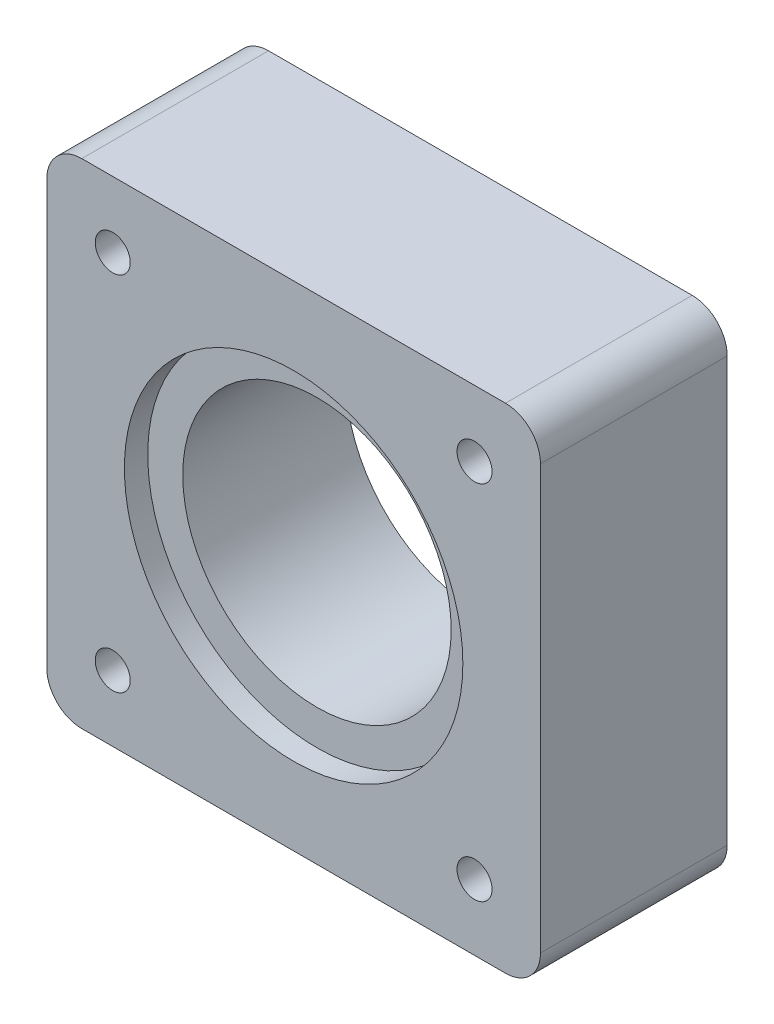
ISO-10303-21;
HEADER;
FILE_DESCRIPTION(('STEP AP214'),'2;1');
FILE_NAME('part.step','',(''),(''),'','','');
FILE_SCHEMA(('AUTOMOTIVE_DESIGN { 1 0 10303 214 1 1 1 1 }'));
ENDSEC;
DATA;
#1=APPLICATION_CONTEXT('core data for automotive mechanical design processes');
#2=APPLICATION_PROTOCOL_DEFINITION('international standard','automotive_design',2000,#1);
#3=PRODUCT_CONTEXT('',#1,'mechanical');
#4=PRODUCT('Part','Part','',(#3));
#5=PRODUCT_RELATED_PRODUCT_CATEGORY('part','',(#4));
#6=PRODUCT_DEFINITION_FORMATION('','',#4);
#7=PRODUCT_DEFINITION_CONTEXT('part definition',#1,'design');
#8=PRODUCT_DEFINITION('design','',#6,#7);
#9=PRODUCT_DEFINITION_SHAPE('','',#8);
#10=(LENGTH_UNIT() NAMED_UNIT(*) SI_UNIT(.MILLI.,.METRE.));
#11=(NAMED_UNIT(*) PLANE_ANGLE_UNIT() SI_UNIT($,.RADIAN.));
#12=(NAMED_UNIT(*) SI_UNIT($,.STERADIAN.) SOLID_ANGLE_UNIT());
#13=UNCERTAINTY_MEASURE_WITH_UNIT(LENGTH_MEASURE(1.E-05),#10,'distance_accuracy_value','');
#14=(GEOMETRIC_REPRESENTATION_CONTEXT(3) GLOBAL_UNCERTAINTY_ASSIGNED_CONTEXT((#13)) GLOBAL_UNIT_ASSIGNED_CONTEXT((#10,
#11,#12)) REPRESENTATION_CONTEXT('',''));
#15=CARTESIAN_POINT('',(0.,0.,0.));
#16=DIRECTION('',(0.,0.,1.));
#17=DIRECTION('',(1.,0.,0.));
#18=AXIS2_PLACEMENT_3D('',#15,#16,#17);
#19=CARTESIAN_POINT('',(21.15,21.15,16.));
#20=DIRECTION('',(0.,0.,-1.));
#21=DIRECTION('',(-1.,0.,0.));
#22=AXIS2_PLACEMENT_3D('',#19,#20,#21);
#23=CYLINDRICAL_SURFACE('',#22,11.5);
#24=CARTESIAN_POINT('',(21.15,21.15,0.));
#25=DIRECTION('',(0.,0.,1.));
#26=DIRECTION('',(1.,0.,0.));
#27=AXIS2_PLACEMENT_3D('',#24,#25,#26);
#28=CIRCLE('',#27,11.5);
#29=CARTESIAN_POINT('',(32.65,21.15,0.));
#30=VERTEX_POINT('',#29);
#31=EDGE_CURVE('E165',#30,#30,#28,.T.);
#32=ORIENTED_EDGE('',*,*,#31,.F.);
#33=EDGE_LOOP('',(#32));
#34=FACE_BOUND('',#33,.T.);
#35=CARTESIAN_POINT('',(21.15,21.15,14.));
#36=DIRECTION('',(0.,0.,1.));
#37=DIRECTION('',(1.,0.,0.));
#38=AXIS2_PLACEMENT_3D('',#35,#36,#37);
#39=CIRCLE('',#38,11.5);
#40=CARTESIAN_POINT('',(32.65,21.15,14.));
#41=VERTEX_POINT('',#40);
#42=EDGE_CURVE('E36',#41,#41,#39,.T.);
#43=ORIENTED_EDGE('',*,*,#42,.T.);
#44=EDGE_LOOP('',(#43));
#45=FACE_BOUND('',#44,.T.);
#46=ADVANCED_FACE('F32',(#34,#45),#23,.F.);
#47=CARTESIAN_POINT('',(0.,0.,16.));
#48=DIRECTION('',(1.,0.,0.));
#49=DIRECTION('',(0.,0.,-1.));
#50=AXIS2_PLACEMENT_3D('',#47,#48,#49);
#51=PLANE('',#50);
#52=DIRECTION('',(0.,-1.,0.));
#53=VECTOR('',#52,1.);
#54=CARTESIAN_POINT('',(0.,0.,0.));
#55=LINE('',#54,#53);
#56=CARTESIAN_POINT('',(0.,39.3,0.));
#57=VERTEX_POINT('',#56);
#58=CARTESIAN_POINT('',(0.,3.,0.));
#59=VERTEX_POINT('',#58);
#60=EDGE_CURVE('E115',#57,#59,#55,.T.);
#61=ORIENTED_EDGE('',*,*,#60,.T.);
#62=DIRECTION('',(0.,0.,-1.));
#63=VECTOR('',#62,1.);
#64=CARTESIAN_POINT('',(0.,3.,16.));
#65=LINE('',#64,#63);
#66=CARTESIAN_POINT('',(0.,3.,16.));
#67=VERTEX_POINT('',#66);
#68=EDGE_CURVE('E11',#59,#67,#65,.F.);
#69=ORIENTED_EDGE('',*,*,#68,.T.);
#70=DIRECTION('',(0.,-1.,0.));
#71=VECTOR('',#70,1.);
#72=CARTESIAN_POINT('',(0.,0.,16.));
#73=LINE('',#72,#71);
#74=CARTESIAN_POINT('',(0.,39.3,16.));
#75=VERTEX_POINT('',#74);
#76=EDGE_CURVE('E116',#75,#67,#73,.T.);
#77=ORIENTED_EDGE('',*,*,#76,.F.);
#78=DIRECTION('',(0.,0.,-1.));
#79=VECTOR('',#78,1.);
#80=CARTESIAN_POINT('',(0.,39.3,16.));
#81=LINE('',#80,#79);
#82=EDGE_CURVE('E105',#75,#57,#81,.T.);
#83=ORIENTED_EDGE('',*,*,#82,.T.);
#84=EDGE_LOOP('',(#61,#69,#77,#83));
#85=FACE_BOUND('',#84,.T.);
#86=ADVANCED_FACE('F114',(#85),#51,.F.);
#87=CARTESIAN_POINT('',(0.,0.,16.));
#88=DIRECTION('',(0.,1.,0.));
#89=DIRECTION('',(0.,0.,1.));
#90=AXIS2_PLACEMENT_3D('',#87,#88,#89);
#91=PLANE('',#90);
#92=DIRECTION('',(1.,0.,0.));
#93=VECTOR('',#92,1.);
#94=CARTESIAN_POINT('',(0.,0.,0.));
#95=LINE('',#94,#93);
#96=CARTESIAN_POINT('',(3.,0.,0.));
#97=VERTEX_POINT('',#96);
#98=CARTESIAN_POINT('',(39.3,0.,0.));
#99=VERTEX_POINT('',#98);
#100=EDGE_CURVE('E123',#97,#99,#95,.T.);
#101=ORIENTED_EDGE('',*,*,#100,.T.);
#102=DIRECTION('',(0.,0.,-1.));
#103=VECTOR('',#102,1.);
#104=CARTESIAN_POINT('',(39.3,0.,16.));
#105=LINE('',#104,#103);
#106=CARTESIAN_POINT('',(39.3,0.,16.));
#107=VERTEX_POINT('',#106);
#108=EDGE_CURVE('E55',#99,#107,#105,.F.);
#109=ORIENTED_EDGE('',*,*,#108,.T.);
#110=DIRECTION('',(1.,0.,0.));
#111=VECTOR('',#110,1.);
#112=CARTESIAN_POINT('',(0.,0.,16.));
#113=LINE('',#112,#111);
#114=CARTESIAN_POINT('',(3.,0.,16.));
#115=VERTEX_POINT('',#114);
#116=EDGE_CURVE('E197',#115,#107,#113,.T.);
#117=ORIENTED_EDGE('',*,*,#116,.F.);
#118=DIRECTION('',(0.,0.,-1.));
#119=VECTOR('',#118,1.);
#120=CARTESIAN_POINT('',(3.,0.,16.));
#121=LINE('',#120,#119);
#122=EDGE_CURVE('E155',#115,#97,#121,.T.);
#123=ORIENTED_EDGE('',*,*,#122,.T.);
#124=EDGE_LOOP('',(#101,#109,#117,#123));
#125=FACE_BOUND('',#124,.T.);
#126=ADVANCED_FACE('F219',(#125),#91,.F.);
#127=CARTESIAN_POINT('',(42.3,0.,16.));
#128=DIRECTION('',(-1.,0.,0.));
#129=DIRECTION('',(0.,0.,1.));
#130=AXIS2_PLACEMENT_3D('',#127,#128,#129);
#131=PLANE('',#130);
#132=DIRECTION('',(0.,1.,0.));
#133=VECTOR('',#132,1.);
#134=CARTESIAN_POINT('',(42.3,0.,16.));
#135=LINE('',#134,#133);
#136=CARTESIAN_POINT('',(42.3,3.,16.));
#137=VERTEX_POINT('',#136);
#138=CARTESIAN_POINT('',(42.3,39.3,16.));
#139=VERTEX_POINT('',#138);
#140=EDGE_CURVE('E198',#137,#139,#135,.T.);
#141=ORIENTED_EDGE('',*,*,#140,.F.);
#142=DIRECTION('',(0.,0.,-1.));
#143=VECTOR('',#142,1.);
#144=CARTESIAN_POINT('',(42.3,3.,16.));
#145=LINE('',#144,#143);
#146=CARTESIAN_POINT('',(42.3,3.,0.));
#147=VERTEX_POINT('',#146);
#148=EDGE_CURVE('E149',#137,#147,#145,.T.);
#149=ORIENTED_EDGE('',*,*,#148,.T.);
#150=DIRECTION('',(0.,1.,0.));
#151=VECTOR('',#150,1.);
#152=CARTESIAN_POINT('',(42.3,0.,0.));
#153=LINE('',#152,#151);
#154=CARTESIAN_POINT('',(42.3,39.3,0.));
#155=VERTEX_POINT('',#154);
#156=EDGE_CURVE('E126',#147,#155,#153,.T.);
#157=ORIENTED_EDGE('',*,*,#156,.T.);
#158=DIRECTION('',(0.,0.,-1.));
#159=VECTOR('',#158,1.);
#160=CARTESIAN_POINT('',(42.3,39.3,16.));
#161=LINE('',#160,#159);
#162=EDGE_CURVE('E146',#155,#139,#161,.F.);
#163=ORIENTED_EDGE('',*,*,#162,.T.);
#164=EDGE_LOOP('',(#141,#149,#157,#163));
#165=FACE_BOUND('',#164,.T.);
#166=ADVANCED_FACE('F212',(#165),#131,.F.);
#167=CARTESIAN_POINT('',(0.,42.3,16.));
#168=DIRECTION('',(0.,-1.,0.));
#169=DIRECTION('',(0.,0.,-1.));
#170=AXIS2_PLACEMENT_3D('',#167,#168,#169);
#171=PLANE('',#170);
#172=DIRECTION('',(-1.,0.,0.));
#173=VECTOR('',#172,1.);
#174=CARTESIAN_POINT('',(0.,42.3,0.));
#175=LINE('',#174,#173);
#176=CARTESIAN_POINT('',(39.3,42.3,0.));
#177=VERTEX_POINT('',#176);
#178=CARTESIAN_POINT('',(3.,42.3,0.));
#179=VERTEX_POINT('',#178);
#180=EDGE_CURVE('E135',#177,#179,#175,.T.);
#181=ORIENTED_EDGE('',*,*,#180,.T.);
#182=DIRECTION('',(0.,0.,-1.));
#183=VECTOR('',#182,1.);
#184=CARTESIAN_POINT('',(3.,42.3,16.));
#185=LINE('',#184,#183);
#186=CARTESIAN_POINT('',(3.,42.3,16.));
#187=VERTEX_POINT('',#186);
#188=EDGE_CURVE('E106',#179,#187,#185,.F.);
#189=ORIENTED_EDGE('',*,*,#188,.T.);
#190=DIRECTION('',(-1.,0.,0.));
#191=VECTOR('',#190,1.);
#192=CARTESIAN_POINT('',(0.,42.3,16.));
#193=LINE('',#192,#191);
#194=CARTESIAN_POINT('',(39.3,42.3,16.));
#195=VERTEX_POINT('',#194);
#196=EDGE_CURVE('E117',#195,#187,#193,.T.);
#197=ORIENTED_EDGE('',*,*,#196,.F.);
#198=DIRECTION('',(0.,0.,-1.));
#199=VECTOR('',#198,1.);
#200=CARTESIAN_POINT('',(39.3,42.3,16.));
#201=LINE('',#200,#199);
#202=EDGE_CURVE('E111',#195,#177,#201,.T.);
#203=ORIENTED_EDGE('',*,*,#202,.T.);
#204=EDGE_LOOP('',(#181,#189,#197,#203));
#205=FACE_BOUND('',#204,.T.);
#206=ADVANCED_FACE('F207',(#205),#171,.F.);
#207=CARTESIAN_POINT('',(0.,0.,16.));
#208=DIRECTION('',(0.,0.,-1.));
#209=DIRECTION('',(-1.,0.,0.));
#210=AXIS2_PLACEMENT_3D('',#207,#208,#209);
#211=PLANE('',#210);
#212=CARTESIAN_POINT('',(21.15,21.15,16.));
#213=DIRECTION('',(0.,0.,1.));
#214=DIRECTION('',(1.,0.,0.));
#215=AXIS2_PLACEMENT_3D('',#212,#213,#214);
#216=CIRCLE('',#215,14.5);
#217=CARTESIAN_POINT('',(35.65,21.15,16.));
#218=VERTEX_POINT('',#217);
#219=EDGE_CURVE('E474',#218,#218,#216,.T.);
#220=ORIENTED_EDGE('',*,*,#219,.F.);
#221=EDGE_LOOP('',(#220));
#222=FACE_BOUND('',#221,.T.);
#223=CARTESIAN_POINT('',(5.65,36.65,16.));
#224=DIRECTION('',(0.,0.,1.));
#225=DIRECTION('',(1.,0.,0.));
#226=AXIS2_PLACEMENT_3D('',#223,#224,#225);
#227=CIRCLE('',#226,1.5);
#228=CARTESIAN_POINT('',(7.15,36.65,16.));
#229=VERTEX_POINT('',#228);
#230=EDGE_CURVE('E129',#229,#229,#227,.T.);
#231=ORIENTED_EDGE('',*,*,#230,.F.);
#232=EDGE_LOOP('',(#231));
#233=FACE_BOUND('',#232,.T.);
#234=CARTESIAN_POINT('',(5.65,5.65,16.));
#235=DIRECTION('',(0.,0.,1.));
#236=DIRECTION('',(1.,0.,0.));
#237=AXIS2_PLACEMENT_3D('',#234,#235,#236);
#238=CIRCLE('',#237,1.5);
#239=CARTESIAN_POINT('',(7.15,5.65,16.));
#240=VERTEX_POINT('',#239);
#241=EDGE_CURVE('E191',#240,#240,#238,.T.);
#242=ORIENTED_EDGE('',*,*,#241,.F.);
#243=EDGE_LOOP('',(#242));
#244=FACE_BOUND('',#243,.T.);
#245=CARTESIAN_POINT('',(36.65,5.65,16.));
#246=DIRECTION('',(0.,0.,1.));
#247=DIRECTION('',(1.,0.,0.));
#248=AXIS2_PLACEMENT_3D('',#245,#246,#247);
#249=CIRCLE('',#248,1.5);
#250=CARTESIAN_POINT('',(38.15,5.65,16.));
#251=VERTEX_POINT('',#250);
#252=EDGE_CURVE('E188',#251,#251,#249,.T.);
#253=ORIENTED_EDGE('',*,*,#252,.F.);
#254=EDGE_LOOP('',(#253));
#255=FACE_BOUND('',#254,.T.);
#256=CARTESIAN_POINT('',(36.65,36.65,16.));
#257=DIRECTION('',(0.,0.,1.));
#258=DIRECTION('',(1.,0.,0.));
#259=AXIS2_PLACEMENT_3D('',#256,#257,#258);
#260=CIRCLE('',#259,1.5);
#261=CARTESIAN_POINT('',(38.15,36.65,16.));
#262=VERTEX_POINT('',#261);
#263=EDGE_CURVE('E124',#262,#262,#260,.T.);
#264=ORIENTED_EDGE('',*,*,#263,.F.);
#265=EDGE_LOOP('',(#264));
#266=FACE_BOUND('',#265,.T.);
#267=ORIENTED_EDGE('',*,*,#116,.T.);
#268=CARTESIAN_POINT('',(39.3,3.,16.));
#269=DIRECTION('',(0.,0.,-1.));
#270=DIRECTION('',(-1.,0.,0.));
#271=AXIS2_PLACEMENT_3D('',#268,#269,#270);
#272=CIRCLE('',#271,3.);
#273=EDGE_CURVE('E41',#107,#137,#272,.F.);
#274=ORIENTED_EDGE('',*,*,#273,.T.);
#275=ORIENTED_EDGE('',*,*,#140,.T.);
#276=CARTESIAN_POINT('',(39.3,39.3,16.));
#277=DIRECTION('',(0.,0.,-1.));
#278=DIRECTION('',(-1.,0.,0.));
#279=AXIS2_PLACEMENT_3D('',#276,#277,#278);
#280=CIRCLE('',#279,3.);
#281=EDGE_CURVE('E142',#139,#195,#280,.F.);
#282=ORIENTED_EDGE('',*,*,#281,.T.);
#283=ORIENTED_EDGE('',*,*,#196,.T.);
#284=CARTESIAN_POINT('',(3.,39.3,16.));
#285=DIRECTION('',(0.,0.,-1.));
#286=DIRECTION('',(-1.,0.,0.));
#287=AXIS2_PLACEMENT_3D('',#284,#285,#286);
#288=CIRCLE('',#287,3.);
#289=EDGE_CURVE('E144',#187,#75,#288,.F.);
#290=ORIENTED_EDGE('',*,*,#289,.T.);
#291=ORIENTED_EDGE('',*,*,#76,.T.);
#292=CARTESIAN_POINT('',(3.,3.,16.));
#293=DIRECTION('',(0.,0.,-1.));
#294=DIRECTION('',(-1.,0.,0.));
#295=AXIS2_PLACEMENT_3D('',#292,#293,#294);
#296=CIRCLE('',#295,3.);
#297=EDGE_CURVE('E159',#67,#115,#296,.F.);
#298=ORIENTED_EDGE('',*,*,#297,.T.);
#299=EDGE_LOOP('',(#267,#274,#275,#282,#283,#290,#291,#298));
#300=FACE_BOUND('',#299,.T.);
#301=ADVANCED_FACE('F203',(#222,#233,#244,#255,#266,#300),#211,.F.);
#302=CARTESIAN_POINT('',(0.,0.,0.));
#303=DIRECTION('',(0.,0.,-1.));
#304=DIRECTION('',(-1.,0.,0.));
#305=AXIS2_PLACEMENT_3D('',#302,#303,#304);
#306=PLANE('',#305);
#307=CARTESIAN_POINT('',(13.,6.5,0.));
#308=DIRECTION('',(0.,0.,1.));
#309=DIRECTION('',(1.,0.,0.));
#310=AXIS2_PLACEMENT_3D('',#307,#308,#309);
#311=CIRCLE('',#310,4.35);
#312=CARTESIAN_POINT('',(17.35,6.5,0.));
#313=VERTEX_POINT('',#312);
#314=EDGE_CURVE('E476',#313,#313,#311,.T.);
#315=ORIENTED_EDGE('',*,*,#314,.T.);
#316=EDGE_LOOP('',(#315));
#317=FACE_BOUND('',#316,.T.);
#318=CARTESIAN_POINT('',(29.3,6.5,0.));
#319=DIRECTION('',(0.,0.,1.));
#320=DIRECTION('',(1.,0.,0.));
#321=AXIS2_PLACEMENT_3D('',#318,#319,#320);
#322=CIRCLE('',#321,4.35);
#323=CARTESIAN_POINT('',(33.65,6.5,0.));
#324=VERTEX_POINT('',#323);
#325=EDGE_CURVE('E483',#324,#324,#322,.T.);
#326=ORIENTED_EDGE('',*,*,#325,.T.);
#327=EDGE_LOOP('',(#326));
#328=FACE_BOUND('',#327,.T.);
#329=CARTESIAN_POINT('',(5.65,36.65,0.));
#330=DIRECTION('',(0.,0.,1.));
#331=DIRECTION('',(1.,0.,0.));
#332=AXIS2_PLACEMENT_3D('',#329,#330,#331);
#333=CIRCLE('',#332,2.85);
#334=CARTESIAN_POINT('',(8.5,36.65,0.));
#335=VERTEX_POINT('',#334);
#336=EDGE_CURVE('E494',#335,#335,#333,.T.);
#337=ORIENTED_EDGE('',*,*,#336,.T.);
#338=EDGE_LOOP('',(#337));
#339=FACE_BOUND('',#338,.T.);
#340=CARTESIAN_POINT('',(5.65,5.65,0.));
#341=DIRECTION('',(0.,0.,1.));
#342=DIRECTION('',(1.,0.,0.));
#343=AXIS2_PLACEMENT_3D('',#340,#341,#342);
#344=CIRCLE('',#343,2.85);
#345=CARTESIAN_POINT('',(8.5,5.65,0.));
#346=VERTEX_POINT('',#345);
#347=EDGE_CURVE('E500',#346,#346,#344,.T.);
#348=ORIENTED_EDGE('',*,*,#347,.T.);
#349=EDGE_LOOP('',(#348));
#350=FACE_BOUND('',#349,.T.);
#351=CARTESIAN_POINT('',(36.65,5.65,0.));
#352=DIRECTION('',(0.,0.,1.));
#353=DIRECTION('',(1.,0.,0.));
#354=AXIS2_PLACEMENT_3D('',#351,#352,#353);
#355=CIRCLE('',#354,2.85);
#356=CARTESIAN_POINT('',(39.5,5.65,0.));
#357=VERTEX_POINT('',#356);
#358=EDGE_CURVE('E489',#357,#357,#355,.T.);
#359=ORIENTED_EDGE('',*,*,#358,.T.);
#360=EDGE_LOOP('',(#359));
#361=FACE_BOUND('',#360,.T.);
#362=CARTESIAN_POINT('',(36.65,36.65,0.));
#363=DIRECTION('',(0.,0.,1.));
#364=DIRECTION('',(1.,0.,0.));
#365=AXIS2_PLACEMENT_3D('',#362,#363,#364);
#366=CIRCLE('',#365,2.85);
#367=CARTESIAN_POINT('',(39.5,36.65,0.));
#368=VERTEX_POINT('',#367);
#369=EDGE_CURVE('E175',#368,#368,#366,.T.);
#370=ORIENTED_EDGE('',*,*,#369,.T.);
#371=EDGE_LOOP('',(#370));
#372=FACE_BOUND('',#371,.T.);
#373=ORIENTED_EDGE('',*,*,#31,.T.);
#374=EDGE_LOOP('',(#373));
#375=FACE_BOUND('',#374,.T.);
#376=ORIENTED_EDGE('',*,*,#156,.F.);
#377=CARTESIAN_POINT('',(39.3,3.,0.));
#378=DIRECTION('',(0.,0.,-1.));
#379=DIRECTION('',(-1.,0.,0.));
#380=AXIS2_PLACEMENT_3D('',#377,#378,#379);
#381=CIRCLE('',#380,3.);
#382=EDGE_CURVE('E153',#147,#99,#381,.T.);
#383=ORIENTED_EDGE('',*,*,#382,.T.);
#384=ORIENTED_EDGE('',*,*,#100,.F.);
#385=CARTESIAN_POINT('',(3.,3.,0.));
#386=DIRECTION('',(0.,0.,-1.));
#387=DIRECTION('',(-1.,0.,0.));
#388=AXIS2_PLACEMENT_3D('',#385,#386,#387);
#389=CIRCLE('',#388,3.);
#390=EDGE_CURVE('E122',#97,#59,#389,.T.);
#391=ORIENTED_EDGE('',*,*,#390,.T.);
#392=ORIENTED_EDGE('',*,*,#60,.F.);
#393=CARTESIAN_POINT('',(3.,39.3,0.));
#394=DIRECTION('',(0.,0.,-1.));
#395=DIRECTION('',(-1.,0.,0.));
#396=AXIS2_PLACEMENT_3D('',#393,#394,#395);
#397=CIRCLE('',#396,3.);
#398=EDGE_CURVE('E101',#57,#179,#397,.T.);
#399=ORIENTED_EDGE('',*,*,#398,.T.);
#400=ORIENTED_EDGE('',*,*,#180,.F.);
#401=CARTESIAN_POINT('',(39.3,39.3,0.));
#402=DIRECTION('',(0.,0.,-1.));
#403=DIRECTION('',(-1.,0.,0.));
#404=AXIS2_PLACEMENT_3D('',#401,#402,#403);
#405=CIRCLE('',#404,3.);
#406=EDGE_CURVE('E112',#177,#155,#405,.T.);
#407=ORIENTED_EDGE('',*,*,#406,.T.);
#408=EDGE_LOOP('',(#376,#383,#384,#391,#392,#399,#400,#407));
#409=FACE_BOUND('',#408,.T.);
#410=ADVANCED_FACE('F120',(#317,#328,#339,#350,#361,#372,#375,#409),#306,.T.);
#411=CARTESIAN_POINT('',(36.65,36.65,16.));
#412=DIRECTION('',(0.,0.,-1.));
#413=DIRECTION('',(-1.,0.,0.));
#414=AXIS2_PLACEMENT_3D('',#411,#412,#413);
#415=CYLINDRICAL_SURFACE('',#414,1.5);
#416=CARTESIAN_POINT('',(36.65,36.65,10.));
#417=DIRECTION('',(0.,0.,1.));
#418=DIRECTION('',(1.,0.,0.));
#419=AXIS2_PLACEMENT_3D('',#416,#417,#418);
#420=CIRCLE('',#419,1.5);
#421=CARTESIAN_POINT('',(38.15,36.65,10.));
#422=VERTEX_POINT('',#421);
#423=EDGE_CURVE('E162',#422,#422,#420,.T.);
#424=ORIENTED_EDGE('',*,*,#423,.F.);
#425=EDGE_LOOP('',(#424));
#426=FACE_BOUND('',#425,.T.);
#427=ORIENTED_EDGE('',*,*,#263,.T.);
#428=EDGE_LOOP('',(#427));
#429=FACE_BOUND('',#428,.T.);
#430=ADVANCED_FACE('F252',(#426,#429),#415,.F.);
#431=CARTESIAN_POINT('',(36.65,5.65,16.));
#432=DIRECTION('',(0.,0.,-1.));
#433=DIRECTION('',(-1.,0.,0.));
#434=AXIS2_PLACEMENT_3D('',#431,#432,#433);
#435=CYLINDRICAL_SURFACE('',#434,1.5);
#436=CARTESIAN_POINT('',(36.65,5.65,10.));
#437=DIRECTION('',(0.,0.,1.));
#438=DIRECTION('',(1.,0.,0.));
#439=AXIS2_PLACEMENT_3D('',#436,#437,#438);
#440=CIRCLE('',#439,1.5);
#441=CARTESIAN_POINT('',(38.15,5.65,10.));
#442=VERTEX_POINT('',#441);
#443=EDGE_CURVE('E173',#442,#442,#440,.T.);
#444=ORIENTED_EDGE('',*,*,#443,.F.);
#445=EDGE_LOOP('',(#444));
#446=FACE_BOUND('',#445,.T.);
#447=ORIENTED_EDGE('',*,*,#252,.T.);
#448=EDGE_LOOP('',(#447));
#449=FACE_BOUND('',#448,.T.);
#450=ADVANCED_FACE('F248',(#446,#449),#435,.F.);
#451=CARTESIAN_POINT('',(5.65,5.65,16.));
#452=DIRECTION('',(0.,0.,-1.));
#453=DIRECTION('',(-1.,0.,0.));
#454=AXIS2_PLACEMENT_3D('',#451,#452,#453);
#455=CYLINDRICAL_SURFACE('',#454,1.5);
#456=CARTESIAN_POINT('',(5.65,5.65,10.));
#457=DIRECTION('',(0.,0.,1.));
#458=DIRECTION('',(1.,0.,0.));
#459=AXIS2_PLACEMENT_3D('',#456,#457,#458);
#460=CIRCLE('',#459,1.5);
#461=CARTESIAN_POINT('',(7.15,5.65,10.));
#462=VERTEX_POINT('',#461);
#463=EDGE_CURVE('E170',#462,#462,#460,.T.);
#464=ORIENTED_EDGE('',*,*,#463,.F.);
#465=EDGE_LOOP('',(#464));
#466=FACE_BOUND('',#465,.T.);
#467=ORIENTED_EDGE('',*,*,#241,.T.);
#468=EDGE_LOOP('',(#467));
#469=FACE_BOUND('',#468,.T.);
#470=ADVANCED_FACE('F244',(#466,#469),#455,.F.);
#471=CARTESIAN_POINT('',(5.65,36.65,16.));
#472=DIRECTION('',(0.,0.,-1.));
#473=DIRECTION('',(-1.,0.,0.));
#474=AXIS2_PLACEMENT_3D('',#471,#472,#473);
#475=CYLINDRICAL_SURFACE('',#474,1.5);
#476=CARTESIAN_POINT('',(5.65,36.65,10.));
#477=DIRECTION('',(0.,0.,1.));
#478=DIRECTION('',(1.,0.,0.));
#479=AXIS2_PLACEMENT_3D('',#476,#477,#478);
#480=CIRCLE('',#479,1.5);
#481=CARTESIAN_POINT('',(7.15,36.65,10.));
#482=VERTEX_POINT('',#481);
#483=EDGE_CURVE('E167',#482,#482,#480,.T.);
#484=ORIENTED_EDGE('',*,*,#483,.F.);
#485=EDGE_LOOP('',(#484));
#486=FACE_BOUND('',#485,.T.);
#487=ORIENTED_EDGE('',*,*,#230,.T.);
#488=EDGE_LOOP('',(#487));
#489=FACE_BOUND('',#488,.T.);
#490=ADVANCED_FACE('F241',(#486,#489),#475,.F.);
#491=CARTESIAN_POINT('',(3.,39.3,16.));
#492=DIRECTION('',(0.,0.,-1.));
#493=DIRECTION('',(-1.,0.,0.));
#494=AXIS2_PLACEMENT_3D('',#491,#492,#493);
#495=CYLINDRICAL_SURFACE('',#494,3.);
#496=ORIENTED_EDGE('',*,*,#289,.F.);
#497=ORIENTED_EDGE('',*,*,#188,.F.);
#498=ORIENTED_EDGE('',*,*,#398,.F.);
#499=ORIENTED_EDGE('',*,*,#82,.F.);
#500=EDGE_LOOP('',(#496,#497,#498,#499));
#501=FACE_BOUND('',#500,.T.);
#502=ADVANCED_FACE('F104',(#501),#495,.T.);
#503=CARTESIAN_POINT('',(39.3,39.3,16.));
#504=DIRECTION('',(0.,0.,-1.));
#505=DIRECTION('',(-1.,0.,0.));
#506=AXIS2_PLACEMENT_3D('',#503,#504,#505);
#507=CYLINDRICAL_SURFACE('',#506,3.);
#508=ORIENTED_EDGE('',*,*,#281,.F.);
#509=ORIENTED_EDGE('',*,*,#162,.F.);
#510=ORIENTED_EDGE('',*,*,#406,.F.);
#511=ORIENTED_EDGE('',*,*,#202,.F.);
#512=EDGE_LOOP('',(#508,#509,#510,#511));
#513=FACE_BOUND('',#512,.T.);
#514=ADVANCED_FACE('F209',(#513),#507,.T.);
#515=CARTESIAN_POINT('',(39.3,3.,16.));
#516=DIRECTION('',(0.,0.,-1.));
#517=DIRECTION('',(-1.,0.,0.));
#518=AXIS2_PLACEMENT_3D('',#515,#516,#517);
#519=CYLINDRICAL_SURFACE('',#518,3.);
#520=ORIENTED_EDGE('',*,*,#273,.F.);
#521=ORIENTED_EDGE('',*,*,#108,.F.);
#522=ORIENTED_EDGE('',*,*,#382,.F.);
#523=ORIENTED_EDGE('',*,*,#148,.F.);
#524=EDGE_LOOP('',(#520,#521,#522,#523));
#525=FACE_BOUND('',#524,.T.);
#526=ADVANCED_FACE('F216',(#525),#519,.T.);
#527=CARTESIAN_POINT('',(3.,3.,16.));
#528=DIRECTION('',(0.,0.,-1.));
#529=DIRECTION('',(-1.,0.,0.));
#530=AXIS2_PLACEMENT_3D('',#527,#528,#529);
#531=CYLINDRICAL_SURFACE('',#530,3.);
#532=ORIENTED_EDGE('',*,*,#297,.F.);
#533=ORIENTED_EDGE('',*,*,#68,.F.);
#534=ORIENTED_EDGE('',*,*,#390,.F.);
#535=ORIENTED_EDGE('',*,*,#122,.F.);
#536=EDGE_LOOP('',(#532,#533,#534,#535));
#537=FACE_BOUND('',#536,.T.);
#538=ADVANCED_FACE('F34',(#537),#531,.T.);
#539=CARTESIAN_POINT('',(36.65,36.65,10.));
#540=DIRECTION('',(0.,0.,-1.));
#541=DIRECTION('',(-1.,0.,0.));
#542=AXIS2_PLACEMENT_3D('',#539,#540,#541);
#543=CYLINDRICAL_SURFACE('',#542,2.85);
#544=CARTESIAN_POINT('',(36.65,36.65,10.));
#545=DIRECTION('',(0.,0.,1.));
#546=DIRECTION('',(1.,0.,0.));
#547=AXIS2_PLACEMENT_3D('',#544,#545,#546);
#548=CIRCLE('',#547,2.85);
#549=CARTESIAN_POINT('',(39.5,36.65,10.));
#550=VERTEX_POINT('',#549);
#551=EDGE_CURVE('E166',#550,#550,#548,.T.);
#552=ORIENTED_EDGE('',*,*,#551,.T.);
#553=EDGE_LOOP('',(#552));
#554=FACE_BOUND('',#553,.T.);
#555=ORIENTED_EDGE('',*,*,#369,.F.);
#556=EDGE_LOOP('',(#555));
#557=FACE_BOUND('',#556,.T.);
#558=ADVANCED_FACE('F222',(#554,#557),#543,.F.);
#559=CARTESIAN_POINT('',(36.65,36.65,10.));
#560=DIRECTION('',(0.,0.,1.));
#561=DIRECTION('',(1.,0.,0.));
#562=AXIS2_PLACEMENT_3D('',#559,#560,#561);
#563=PLANE('',#562);
#564=ORIENTED_EDGE('',*,*,#423,.T.);
#565=EDGE_LOOP('',(#564));
#566=FACE_BOUND('',#565,.T.);
#567=ORIENTED_EDGE('',*,*,#551,.F.);
#568=EDGE_LOOP('',(#567));
#569=FACE_BOUND('',#568,.T.);
#570=ADVANCED_FACE('F227',(#566,#569),#563,.F.);
#571=CARTESIAN_POINT('',(5.65,36.65,10.));
#572=DIRECTION('',(0.,0.,-1.));
#573=DIRECTION('',(-1.,0.,0.));
#574=AXIS2_PLACEMENT_3D('',#571,#572,#573);
#575=CYLINDRICAL_SURFACE('',#574,2.85);
#576=CARTESIAN_POINT('',(5.65,36.65,10.));
#577=DIRECTION('',(0.,0.,1.));
#578=DIRECTION('',(1.,0.,0.));
#579=AXIS2_PLACEMENT_3D('',#576,#577,#578);
#580=CIRCLE('',#579,2.85);
#581=CARTESIAN_POINT('',(8.5,36.65,10.));
#582=VERTEX_POINT('',#581);
#583=EDGE_CURVE('E171',#582,#582,#580,.T.);
#584=ORIENTED_EDGE('',*,*,#583,.T.);
#585=EDGE_LOOP('',(#584));
#586=FACE_BOUND('',#585,.T.);
#587=ORIENTED_EDGE('',*,*,#336,.F.);
#588=EDGE_LOOP('',(#587));
#589=FACE_BOUND('',#588,.T.);
#590=ADVANCED_FACE('F330',(#586,#589),#575,.F.);
#591=CARTESIAN_POINT('',(5.65,36.65,10.));
#592=DIRECTION('',(0.,0.,1.));
#593=DIRECTION('',(1.,0.,0.));
#594=AXIS2_PLACEMENT_3D('',#591,#592,#593);
#595=PLANE('',#594);
#596=ORIENTED_EDGE('',*,*,#483,.T.);
#597=EDGE_LOOP('',(#596));
#598=FACE_BOUND('',#597,.T.);
#599=ORIENTED_EDGE('',*,*,#583,.F.);
#600=EDGE_LOOP('',(#599));
#601=FACE_BOUND('',#600,.T.);
#602=ADVANCED_FACE('F339',(#598,#601),#595,.F.);
#603=CARTESIAN_POINT('',(5.65,5.65,10.));
#604=DIRECTION('',(0.,0.,-1.));
#605=DIRECTION('',(-1.,0.,0.));
#606=AXIS2_PLACEMENT_3D('',#603,#604,#605);
#607=CYLINDRICAL_SURFACE('',#606,2.85);
#608=CARTESIAN_POINT('',(5.65,5.65,10.));
#609=DIRECTION('',(0.,0.,1.));
#610=DIRECTION('',(1.,0.,0.));
#611=AXIS2_PLACEMENT_3D('',#608,#609,#610);
#612=CIRCLE('',#611,2.85);
#613=CARTESIAN_POINT('',(8.5,5.65,10.));
#614=VERTEX_POINT('',#613);
#615=EDGE_CURVE('E497',#614,#614,#612,.T.);
#616=ORIENTED_EDGE('',*,*,#615,.T.);
#617=EDGE_LOOP('',(#616));
#618=FACE_BOUND('',#617,.T.);
#619=ORIENTED_EDGE('',*,*,#347,.F.);
#620=EDGE_LOOP('',(#619));
#621=FACE_BOUND('',#620,.T.);
#622=ADVANCED_FACE('F349',(#618,#621),#607,.F.);
#623=CARTESIAN_POINT('',(5.65,5.65,10.));
#624=DIRECTION('',(0.,0.,1.));
#625=DIRECTION('',(1.,0.,0.));
#626=AXIS2_PLACEMENT_3D('',#623,#624,#625);
#627=PLANE('',#626);
#628=ORIENTED_EDGE('',*,*,#463,.T.);
#629=EDGE_LOOP('',(#628));
#630=FACE_BOUND('',#629,.T.);
#631=ORIENTED_EDGE('',*,*,#615,.F.);
#632=EDGE_LOOP('',(#631));
#633=FACE_BOUND('',#632,.T.);
#634=ADVANCED_FACE('F359',(#630,#633),#627,.F.);
#635=CARTESIAN_POINT('',(36.65,5.65,10.));
#636=DIRECTION('',(0.,0.,-1.));
#637=DIRECTION('',(-1.,0.,0.));
#638=AXIS2_PLACEMENT_3D('',#635,#636,#637);
#639=CYLINDRICAL_SURFACE('',#638,2.85);
#640=CARTESIAN_POINT('',(36.65,5.65,10.));
#641=DIRECTION('',(0.,0.,1.));
#642=DIRECTION('',(1.,0.,0.));
#643=AXIS2_PLACEMENT_3D('',#640,#641,#642);
#644=CIRCLE('',#643,2.85);
#645=CARTESIAN_POINT('',(39.5,5.65,10.));
#646=VERTEX_POINT('',#645);
#647=EDGE_CURVE('E503',#646,#646,#644,.T.);
#648=ORIENTED_EDGE('',*,*,#647,.T.);
#649=EDGE_LOOP('',(#648));
#650=FACE_BOUND('',#649,.T.);
#651=ORIENTED_EDGE('',*,*,#358,.F.);
#652=EDGE_LOOP('',(#651));
#653=FACE_BOUND('',#652,.T.);
#654=ADVANCED_FACE('F369',(#650,#653),#639,.F.);
#655=CARTESIAN_POINT('',(36.65,5.65,10.));
#656=DIRECTION('',(0.,0.,1.));
#657=DIRECTION('',(1.,0.,0.));
#658=AXIS2_PLACEMENT_3D('',#655,#656,#657);
#659=PLANE('',#658);
#660=ORIENTED_EDGE('',*,*,#443,.T.);
#661=EDGE_LOOP('',(#660));
#662=FACE_BOUND('',#661,.T.);
#663=ORIENTED_EDGE('',*,*,#647,.F.);
#664=EDGE_LOOP('',(#663));
#665=FACE_BOUND('',#664,.T.);
#666=ADVANCED_FACE('F379',(#662,#665),#659,.F.);
#667=CARTESIAN_POINT('',(29.3,6.5,12.));
#668=DIRECTION('',(0.,0.,-1.));
#669=DIRECTION('',(-1.,0.,0.));
#670=AXIS2_PLACEMENT_3D('',#667,#668,#669);
#671=CYLINDRICAL_SURFACE('',#670,4.35);
#672=CARTESIAN_POINT('',(29.3,6.5,12.));
#673=DIRECTION('',(0.,0.,1.));
#674=DIRECTION('',(1.,0.,0.));
#675=AXIS2_PLACEMENT_3D('',#672,#673,#674);
#676=CIRCLE('',#675,4.35);
#677=CARTESIAN_POINT('',(33.65,6.5,12.));
#678=VERTEX_POINT('',#677);
#679=EDGE_CURVE('E486',#678,#678,#676,.T.);
#680=ORIENTED_EDGE('',*,*,#679,.T.);
#681=EDGE_LOOP('',(#680));
#682=FACE_BOUND('',#681,.T.);
#683=ORIENTED_EDGE('',*,*,#325,.F.);
#684=EDGE_LOOP('',(#683));
#685=FACE_BOUND('',#684,.T.);
#686=ADVANCED_FACE('F389',(#682,#685),#671,.F.);
#687=CARTESIAN_POINT('',(29.3,6.5,12.));
#688=DIRECTION('',(0.,0.,1.));
#689=DIRECTION('',(1.,0.,0.));
#690=AXIS2_PLACEMENT_3D('',#687,#688,#689);
#691=PLANE('',#690);
#692=ORIENTED_EDGE('',*,*,#679,.F.);
#693=EDGE_LOOP('',(#692));
#694=FACE_BOUND('',#693,.T.);
#695=ADVANCED_FACE('F404',(#694),#691,.F.);
#696=CARTESIAN_POINT('',(13.,6.5,12.));
#697=DIRECTION('',(0.,0.,-1.));
#698=DIRECTION('',(-1.,0.,0.));
#699=AXIS2_PLACEMENT_3D('',#696,#697,#698);
#700=CYLINDRICAL_SURFACE('',#699,4.35);
#701=CARTESIAN_POINT('',(13.,6.5,12.));
#702=DIRECTION('',(0.,0.,1.));
#703=DIRECTION('',(1.,0.,0.));
#704=AXIS2_PLACEMENT_3D('',#701,#702,#703);
#705=CIRCLE('',#704,4.35);
#706=CARTESIAN_POINT('',(17.35,6.5,12.));
#707=VERTEX_POINT('',#706);
#708=EDGE_CURVE('E480',#707,#707,#705,.T.);
#709=ORIENTED_EDGE('',*,*,#708,.T.);
#710=EDGE_LOOP('',(#709));
#711=FACE_BOUND('',#710,.T.);
#712=ORIENTED_EDGE('',*,*,#314,.F.);
#713=EDGE_LOOP('',(#712));
#714=FACE_BOUND('',#713,.T.);
#715=ADVANCED_FACE('F414',(#711,#714),#700,.F.);
#716=CARTESIAN_POINT('',(13.,6.5,12.));
#717=DIRECTION('',(0.,0.,1.));
#718=DIRECTION('',(1.,0.,0.));
#719=AXIS2_PLACEMENT_3D('',#716,#717,#718);
#720=PLANE('',#719);
#721=ORIENTED_EDGE('',*,*,#708,.F.);
#722=EDGE_LOOP('',(#721));
#723=FACE_BOUND('',#722,.T.);
#724=ADVANCED_FACE('F424',(#723),#720,.F.);
#725=CARTESIAN_POINT('',(21.15,21.15,14.));
#726=DIRECTION('',(0.,0.,1.));
#727=DIRECTION('',(1.,0.,0.));
#728=AXIS2_PLACEMENT_3D('',#725,#726,#727);
#729=CYLINDRICAL_SURFACE('',#728,14.5);
#730=CARTESIAN_POINT('',(21.15,21.15,14.));
#731=DIRECTION('',(0.,0.,1.));
#732=DIRECTION('',(1.,0.,0.));
#733=AXIS2_PLACEMENT_3D('',#730,#731,#732);
#734=CIRCLE('',#733,14.5);
#735=CARTESIAN_POINT('',(35.65,21.15,14.));
#736=VERTEX_POINT('',#735);
#737=EDGE_CURVE('E473',#736,#736,#734,.T.);
#738=ORIENTED_EDGE('',*,*,#737,.F.);
#739=EDGE_LOOP('',(#738));
#740=FACE_BOUND('',#739,.T.);
#741=ORIENTED_EDGE('',*,*,#219,.T.);
#742=EDGE_LOOP('',(#741));
#743=FACE_BOUND('',#742,.T.);
#744=ADVANCED_FACE('F433',(#740,#743),#729,.F.);
#745=CARTESIAN_POINT('',(21.15,21.15,14.));
#746=DIRECTION('',(0.,0.,1.));
#747=DIRECTION('',(1.,0.,0.));
#748=AXIS2_PLACEMENT_3D('',#745,#746,#747);
#749=PLANE('',#748);
#750=ORIENTED_EDGE('',*,*,#42,.F.);
#751=EDGE_LOOP('',(#750));
#752=FACE_BOUND('',#751,.T.);
#753=ORIENTED_EDGE('',*,*,#737,.T.);
#754=EDGE_LOOP('',(#753));
#755=FACE_BOUND('',#754,.T.);
#756=ADVANCED_FACE('F454',(#752,#755),#749,.T.);
#757=CLOSED_SHELL('',(#46,#86,#126,#166,#206,#301,#410,#430,#450,#470,#490,#502,#514,#526,#538,
#558,#570,#590,#602,#622,#634,#654,#666,#686,#695,#715,#724,#744,#756));
#758=MANIFOLD_SOLID_BREP('B2',#757);
#759=ADVANCED_BREP_SHAPE_REPRESENTATION('',(#18,#758),#14);
#760=SHAPE_DEFINITION_REPRESENTATION(#9,#759);
ENDSEC;
END-ISO-10303-21;
